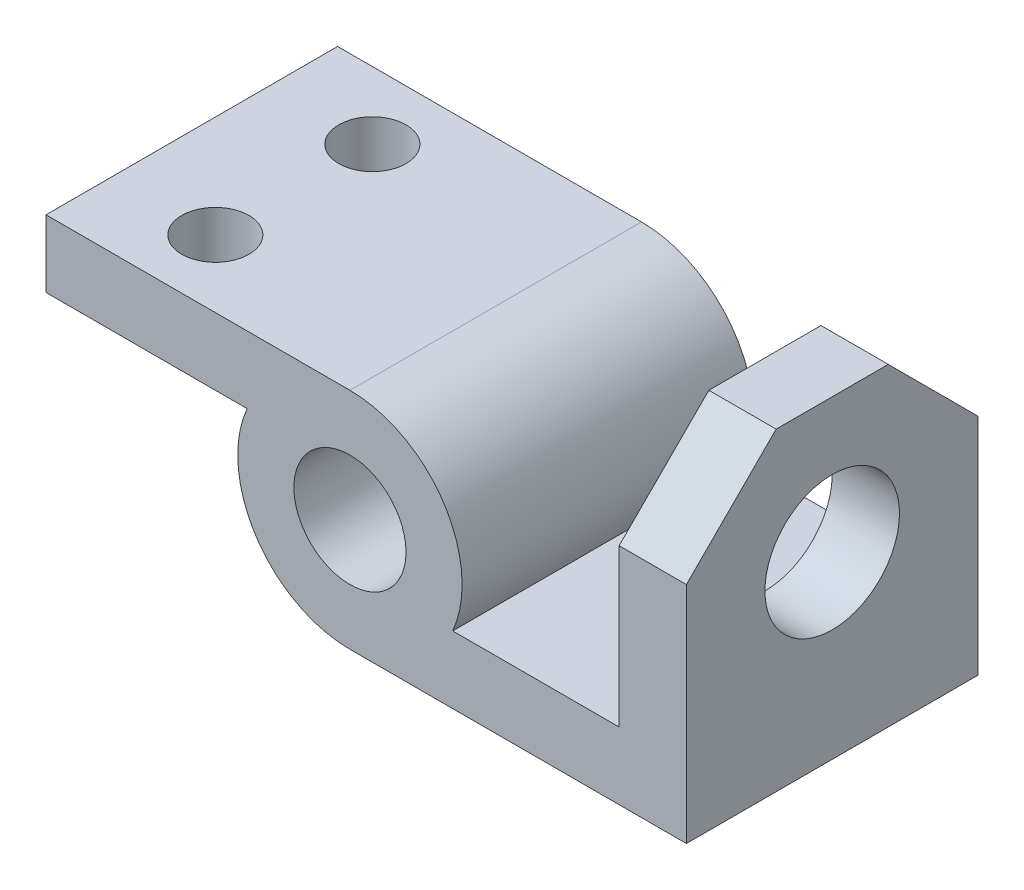
ISO-10303-21;
HEADER;
FILE_DESCRIPTION(('STEP AP214'),'2;1');
FILE_NAME('part.step','',(''),(''),'','','');
FILE_SCHEMA(('AUTOMOTIVE_DESIGN { 1 0 10303 214 1 1 1 1 }'));
ENDSEC;
DATA;
#1=APPLICATION_CONTEXT('core data for automotive mechanical design processes');
#2=APPLICATION_PROTOCOL_DEFINITION('international standard','automotive_design',2000,#1);
#3=PRODUCT_CONTEXT('',#1,'mechanical');
#4=PRODUCT('Part','Part','',(#3));
#5=PRODUCT_RELATED_PRODUCT_CATEGORY('part','',(#4));
#6=PRODUCT_DEFINITION_FORMATION('','',#4);
#7=PRODUCT_DEFINITION_CONTEXT('part definition',#1,'design');
#8=PRODUCT_DEFINITION('design','',#6,#7);
#9=PRODUCT_DEFINITION_SHAPE('','',#8);
#10=(LENGTH_UNIT() NAMED_UNIT(*) SI_UNIT(.MILLI.,.METRE.));
#11=(NAMED_UNIT(*) PLANE_ANGLE_UNIT() SI_UNIT($,.RADIAN.));
#12=(NAMED_UNIT(*) SI_UNIT($,.STERADIAN.) SOLID_ANGLE_UNIT());
#13=UNCERTAINTY_MEASURE_WITH_UNIT(LENGTH_MEASURE(1.E-05),#10,'distance_accuracy_value','');
#14=(GEOMETRIC_REPRESENTATION_CONTEXT(3) GLOBAL_UNCERTAINTY_ASSIGNED_CONTEXT((#13)) GLOBAL_UNIT_ASSIGNED_CONTEXT((#10,
#11,#12)) REPRESENTATION_CONTEXT('',''));
#15=CARTESIAN_POINT('',(0.,0.,0.));
#16=DIRECTION('',(0.,0.,1.));
#17=DIRECTION('',(1.,0.,0.));
#18=AXIS2_PLACEMENT_3D('',#15,#16,#17);
#19=CARTESIAN_POINT('',(0.,1.25,1.625));
#20=DIRECTION('',(0.,-1.,0.));
#21=DIRECTION('',(1.,0.,0.));
#22=AXIS2_PLACEMENT_3D('',#19,#20,#21);
#23=PLANE('',#22);
#24=CARTESIAN_POINT('',(-2.25,1.25,-0.875));
#25=DIRECTION('',(0.,1.,0.));
#26=DIRECTION('',(0.,0.,1.));
#27=AXIS2_PLACEMENT_3D('',#24,#25,#26);
#28=CIRCLE('',#27,0.374999999999998);
#29=CARTESIAN_POINT('',(-2.25,1.25,-0.500000000000002));
#30=VERTEX_POINT('',#29);
#31=EDGE_CURVE('E396',#30,#30,#28,.T.);
#32=ORIENTED_EDGE('',*,*,#31,.F.);
#33=EDGE_LOOP('',(#32));
#34=FACE_BOUND('',#33,.T.);
#35=DIRECTION('',(-1.,0.,0.));
#36=VECTOR('',#35,1.);
#37=CARTESIAN_POINT('',(0.,1.25,-1.625));
#38=LINE('',#37,#36);
#39=CARTESIAN_POINT('',(0.,1.25,-1.625));
#40=VERTEX_POINT('',#39);
#41=CARTESIAN_POINT('',(-3.3875,1.25,-1.625));
#42=VERTEX_POINT('',#41);
#43=EDGE_CURVE('E217',#40,#42,#38,.T.);
#44=ORIENTED_EDGE('',*,*,#43,.T.);
#45=DIRECTION('',(0.,0.,-1.));
#46=VECTOR('',#45,1.);
#47=CARTESIAN_POINT('',(-3.3875,1.25,1.625));
#48=LINE('',#47,#46);
#49=CARTESIAN_POINT('',(-3.3875,1.25,1.625));
#50=VERTEX_POINT('',#49);
#51=EDGE_CURVE('E133',#50,#42,#48,.T.);
#52=ORIENTED_EDGE('',*,*,#51,.F.);
#53=DIRECTION('',(-1.,0.,0.));
#54=VECTOR('',#53,1.);
#55=CARTESIAN_POINT('',(0.,1.25,1.625));
#56=LINE('',#55,#54);
#57=CARTESIAN_POINT('',(0.,1.25,1.625));
#58=VERTEX_POINT('',#57);
#59=EDGE_CURVE('E126',#58,#50,#56,.T.);
#60=ORIENTED_EDGE('',*,*,#59,.F.);
#61=DIRECTION('',(0.,0.,-1.));
#62=VECTOR('',#61,1.);
#63=CARTESIAN_POINT('',(0.,1.25,1.625));
#64=LINE('',#63,#62);
#65=EDGE_CURVE('E130',#58,#40,#64,.T.);
#66=ORIENTED_EDGE('',*,*,#65,.T.);
#67=EDGE_LOOP('',(#44,#52,#60,#66));
#68=FACE_BOUND('',#67,.T.);
#69=CARTESIAN_POINT('',(-2.25,1.25,0.875));
#70=DIRECTION('',(0.,1.,0.));
#71=DIRECTION('',(0.,0.,1.));
#72=AXIS2_PLACEMENT_3D('',#69,#70,#71);
#73=CIRCLE('',#72,0.374999999999998);
#74=CARTESIAN_POINT('',(-2.25,1.25,1.25));
#75=VERTEX_POINT('',#74);
#76=EDGE_CURVE('E402',#75,#75,#73,.T.);
#77=ORIENTED_EDGE('',*,*,#76,.F.);
#78=EDGE_LOOP('',(#77));
#79=FACE_BOUND('',#78,.T.);
#80=ADVANCED_FACE('F37',(#34,#68,#79),#23,.F.);
#81=CARTESIAN_POINT('',(3.75,-0.5,1.625));
#82=DIRECTION('',(0.,-1.,0.));
#83=DIRECTION('',(1.,0.,0.));
#84=AXIS2_PLACEMENT_3D('',#81,#82,#83);
#85=PLANE('',#84);
#86=DIRECTION('',(0.,0.,1.));
#87=VECTOR('',#86,1.);
#88=CARTESIAN_POINT('',(3.,-0.5,1.625));
#89=LINE('',#88,#87);
#90=CARTESIAN_POINT('',(3.,-0.5,-1.625));
#91=VERTEX_POINT('',#90);
#92=CARTESIAN_POINT('',(3.,-0.5,1.625));
#93=VERTEX_POINT('',#92);
#94=EDGE_CURVE('E203',#91,#93,#89,.T.);
#95=ORIENTED_EDGE('',*,*,#94,.F.);
#96=DIRECTION('',(-1.,0.,0.));
#97=VECTOR('',#96,1.);
#98=CARTESIAN_POINT('',(3.75,-0.5,-1.625));
#99=LINE('',#98,#97);
#100=CARTESIAN_POINT('',(1.14564392373896,-0.5,-1.625));
#101=VERTEX_POINT('',#100);
#102=EDGE_CURVE('E145',#91,#101,#99,.T.);
#103=ORIENTED_EDGE('',*,*,#102,.T.);
#104=DIRECTION('',(0.,0.,-1.));
#105=VECTOR('',#104,1.);
#106=CARTESIAN_POINT('',(1.14564392373896,-0.5,1.625));
#107=LINE('',#106,#105);
#108=CARTESIAN_POINT('',(1.14564392373896,-0.5,1.625));
#109=VERTEX_POINT('',#108);
#110=EDGE_CURVE('E215',#109,#101,#107,.T.);
#111=ORIENTED_EDGE('',*,*,#110,.F.);
#112=DIRECTION('',(-1.,0.,0.));
#113=VECTOR('',#112,1.);
#114=CARTESIAN_POINT('',(3.75,-0.5,1.625));
#115=LINE('',#114,#113);
#116=EDGE_CURVE('E141',#93,#109,#115,.T.);
#117=ORIENTED_EDGE('',*,*,#116,.F.);
#118=EDGE_LOOP('',(#95,#103,#111,#117));
#119=FACE_BOUND('',#118,.T.);
#120=ADVANCED_FACE('F266',(#119),#85,.F.);
#121=CARTESIAN_POINT('',(0.,0.,1.625));
#122=DIRECTION('',(0.,0.,-1.));
#123=DIRECTION('',(-1.,0.,0.));
#124=AXIS2_PLACEMENT_3D('',#121,#122,#123);
#125=CYLINDRICAL_SURFACE('',#124,1.25);
#126=CARTESIAN_POINT('',(0.,0.,-1.625));
#127=DIRECTION('',(0.,0.,1.));
#128=DIRECTION('',(1.,0.,0.));
#129=AXIS2_PLACEMENT_3D('',#126,#127,#128);
#130=CIRCLE('',#129,1.25);
#131=EDGE_CURVE('E149',#101,#40,#130,.T.);
#132=ORIENTED_EDGE('',*,*,#131,.T.);
#133=ORIENTED_EDGE('',*,*,#65,.F.);
#134=CARTESIAN_POINT('',(0.,0.,1.625));
#135=DIRECTION('',(0.,0.,1.));
#136=DIRECTION('',(1.,0.,0.));
#137=AXIS2_PLACEMENT_3D('',#134,#135,#136);
#138=CIRCLE('',#137,1.25);
#139=EDGE_CURVE('E136',#109,#58,#138,.T.);
#140=ORIENTED_EDGE('',*,*,#139,.F.);
#141=ORIENTED_EDGE('',*,*,#110,.T.);
#142=EDGE_LOOP('',(#132,#133,#140,#141));
#143=FACE_BOUND('',#142,.T.);
#144=ADVANCED_FACE('F147',(#143),#125,.T.);
#145=CARTESIAN_POINT('',(-3.3875,1.25,1.625));
#146=DIRECTION('',(1.,0.,0.));
#147=DIRECTION('',(0.,1.,0.));
#148=AXIS2_PLACEMENT_3D('',#145,#146,#147);
#149=PLANE('',#148);
#150=DIRECTION('',(0.,-1.,0.));
#151=VECTOR('',#150,1.);
#152=CARTESIAN_POINT('',(-3.3875,1.25,-1.625));
#153=LINE('',#152,#151);
#154=CARTESIAN_POINT('',(-3.3875,0.5,-1.625));
#155=VERTEX_POINT('',#154);
#156=EDGE_CURVE('E219',#42,#155,#153,.T.);
#157=ORIENTED_EDGE('',*,*,#156,.T.);
#158=DIRECTION('',(0.,0.,-1.));
#159=VECTOR('',#158,1.);
#160=CARTESIAN_POINT('',(-3.3875,0.5,1.625));
#161=LINE('',#160,#159);
#162=CARTESIAN_POINT('',(-3.3875,0.5,1.625));
#163=VERTEX_POINT('',#162);
#164=EDGE_CURVE('E155',#163,#155,#161,.T.);
#165=ORIENTED_EDGE('',*,*,#164,.F.);
#166=DIRECTION('',(0.,-1.,0.));
#167=VECTOR('',#166,1.);
#168=CARTESIAN_POINT('',(-3.3875,1.25,1.625));
#169=LINE('',#168,#167);
#170=EDGE_CURVE('E135',#50,#163,#169,.T.);
#171=ORIENTED_EDGE('',*,*,#170,.F.);
#172=ORIENTED_EDGE('',*,*,#51,.T.);
#173=EDGE_LOOP('',(#157,#165,#171,#172));
#174=FACE_BOUND('',#173,.T.);
#175=ADVANCED_FACE('F257',(#174),#149,.F.);
#176=CARTESIAN_POINT('',(-3.3875,0.5,1.625));
#177=DIRECTION('',(0.,1.,0.));
#178=DIRECTION('',(0.,0.,1.));
#179=AXIS2_PLACEMENT_3D('',#176,#177,#178);
#180=PLANE('',#179);
#181=CARTESIAN_POINT('',(-2.25,0.5,0.875));
#182=DIRECTION('',(0.,1.,0.));
#183=DIRECTION('',(0.,0.,1.));
#184=AXIS2_PLACEMENT_3D('',#181,#182,#183);
#185=CIRCLE('',#184,0.374999999999999);
#186=CARTESIAN_POINT('',(-2.25,0.5,1.25));
#187=VERTEX_POINT('',#186);
#188=EDGE_CURVE('E399',#187,#187,#185,.T.);
#189=ORIENTED_EDGE('',*,*,#188,.T.);
#190=EDGE_LOOP('',(#189));
#191=FACE_BOUND('',#190,.T.);
#192=CARTESIAN_POINT('',(-2.25,0.5,-0.875));
#193=DIRECTION('',(0.,1.,0.));
#194=DIRECTION('',(0.,0.,1.));
#195=AXIS2_PLACEMENT_3D('',#192,#193,#194);
#196=CIRCLE('',#195,0.374999999999999);
#197=CARTESIAN_POINT('',(-2.25,0.5,-0.500000000000001));
#198=VERTEX_POINT('',#197);
#199=EDGE_CURVE('E393',#198,#198,#196,.T.);
#200=ORIENTED_EDGE('',*,*,#199,.T.);
#201=EDGE_LOOP('',(#200));
#202=FACE_BOUND('',#201,.T.);
#203=DIRECTION('',(1.,0.,0.));
#204=VECTOR('',#203,1.);
#205=CARTESIAN_POINT('',(-3.3875,0.5,-1.625));
#206=LINE('',#205,#204);
#207=CARTESIAN_POINT('',(-1.14564392373896,0.499999999999999,-1.625));
#208=VERTEX_POINT('',#207);
#209=EDGE_CURVE('E221',#155,#208,#206,.T.);
#210=ORIENTED_EDGE('',*,*,#209,.T.);
#211=DIRECTION('',(0.,0.,-1.));
#212=VECTOR('',#211,1.);
#213=CARTESIAN_POINT('',(-1.14564392373896,0.499999999999999,1.625));
#214=LINE('',#213,#212);
#215=CARTESIAN_POINT('',(-1.14564392373896,0.499999999999999,1.625));
#216=VERTEX_POINT('',#215);
#217=EDGE_CURVE('E235',#216,#208,#214,.T.);
#218=ORIENTED_EDGE('',*,*,#217,.F.);
#219=DIRECTION('',(1.,0.,0.));
#220=VECTOR('',#219,1.);
#221=CARTESIAN_POINT('',(-3.3875,0.5,1.625));
#222=LINE('',#221,#220);
#223=EDGE_CURVE('E206',#163,#216,#222,.T.);
#224=ORIENTED_EDGE('',*,*,#223,.F.);
#225=ORIENTED_EDGE('',*,*,#164,.T.);
#226=EDGE_LOOP('',(#210,#218,#224,#225));
#227=FACE_BOUND('',#226,.T.);
#228=ADVANCED_FACE('F242',(#191,#202,#227),#180,.F.);
#229=CARTESIAN_POINT('',(0.,0.,1.625));
#230=DIRECTION('',(0.,0.,-1.));
#231=DIRECTION('',(-1.,0.,0.));
#232=AXIS2_PLACEMENT_3D('',#229,#230,#231);
#233=CYLINDRICAL_SURFACE('',#232,1.25);
#234=CARTESIAN_POINT('',(0.,0.,-1.625));
#235=DIRECTION('',(0.,0.,1.));
#236=DIRECTION('',(1.,0.,0.));
#237=AXIS2_PLACEMENT_3D('',#234,#235,#236);
#238=CIRCLE('',#237,1.25);
#239=CARTESIAN_POINT('',(0.,-1.25,-1.625));
#240=VERTEX_POINT('',#239);
#241=EDGE_CURVE('E223',#208,#240,#238,.T.);
#242=ORIENTED_EDGE('',*,*,#241,.T.);
#243=DIRECTION('',(0.,0.,-1.));
#244=VECTOR('',#243,1.);
#245=CARTESIAN_POINT('',(0.,-1.25,1.625));
#246=LINE('',#245,#244);
#247=CARTESIAN_POINT('',(0.,-1.25,1.625));
#248=VERTEX_POINT('',#247);
#249=EDGE_CURVE('E232',#248,#240,#246,.T.);
#250=ORIENTED_EDGE('',*,*,#249,.F.);
#251=CARTESIAN_POINT('',(0.,0.,1.625));
#252=DIRECTION('',(0.,0.,1.));
#253=DIRECTION('',(1.,0.,0.));
#254=AXIS2_PLACEMENT_3D('',#251,#252,#253);
#255=CIRCLE('',#254,1.25);
#256=EDGE_CURVE('E208',#216,#248,#255,.T.);
#257=ORIENTED_EDGE('',*,*,#256,.F.);
#258=ORIENTED_EDGE('',*,*,#217,.T.);
#259=EDGE_LOOP('',(#242,#250,#257,#258));
#260=FACE_BOUND('',#259,.T.);
#261=ADVANCED_FACE('F250',(#260),#233,.T.);
#262=CARTESIAN_POINT('',(0.,-1.25,1.625));
#263=DIRECTION('',(0.,1.,0.));
#264=DIRECTION('',(0.,0.,1.));
#265=AXIS2_PLACEMENT_3D('',#262,#263,#264);
#266=PLANE('',#265);
#267=DIRECTION('',(0.,0.,-1.));
#268=VECTOR('',#267,1.);
#269=CARTESIAN_POINT('',(3.75,-1.25,1.625));
#270=LINE('',#269,#268);
#271=CARTESIAN_POINT('',(3.75,-1.25,1.625));
#272=VERTEX_POINT('',#271);
#273=CARTESIAN_POINT('',(3.75,-1.25,-1.625));
#274=VERTEX_POINT('',#273);
#275=EDGE_CURVE('E230',#272,#274,#270,.T.);
#276=ORIENTED_EDGE('',*,*,#275,.F.);
#277=DIRECTION('',(1.,0.,0.));
#278=VECTOR('',#277,1.);
#279=CARTESIAN_POINT('',(0.,-1.25,1.625));
#280=LINE('',#279,#278);
#281=EDGE_CURVE('E210',#248,#272,#280,.T.);
#282=ORIENTED_EDGE('',*,*,#281,.F.);
#283=ORIENTED_EDGE('',*,*,#249,.T.);
#284=DIRECTION('',(1.,0.,0.));
#285=VECTOR('',#284,1.);
#286=CARTESIAN_POINT('',(0.,-1.25,-1.625));
#287=LINE('',#286,#285);
#288=EDGE_CURVE('E225',#240,#274,#287,.T.);
#289=ORIENTED_EDGE('',*,*,#288,.T.);
#290=EDGE_LOOP('',(#276,#282,#283,#289));
#291=FACE_BOUND('',#290,.T.);
#292=ADVANCED_FACE('F255',(#291),#266,.F.);
#293=CARTESIAN_POINT('',(3.75,-1.25,1.625));
#294=DIRECTION('',(-1.,0.,0.));
#295=DIRECTION('',(0.,0.,1.));
#296=AXIS2_PLACEMENT_3D('',#293,#294,#295);
#297=PLANE('',#296);
#298=CARTESIAN_POINT('',(3.75,0.75,0.));
#299=DIRECTION('',(1.,0.,0.));
#300=DIRECTION('',(0.,0.,-1.));
#301=AXIS2_PLACEMENT_3D('',#298,#299,#300);
#302=CIRCLE('',#301,0.749999999999998);
#303=CARTESIAN_POINT('',(3.75,0.75,-0.749999999999998));
#304=VERTEX_POINT('',#303);
#305=EDGE_CURVE('E388',#304,#304,#302,.T.);
#306=ORIENTED_EDGE('',*,*,#305,.F.);
#307=EDGE_LOOP('',(#306));
#308=FACE_BOUND('',#307,.T.);
#309=DIRECTION('',(0.,1.,0.));
#310=VECTOR('',#309,1.);
#311=CARTESIAN_POINT('',(3.75,-1.25,-1.625));
#312=LINE('',#311,#310);
#313=CARTESIAN_POINT('',(3.75,1.25,-1.625));
#314=VERTEX_POINT('',#313);
#315=EDGE_CURVE('E190',#274,#314,#312,.T.);
#316=ORIENTED_EDGE('',*,*,#315,.T.);
#317=DIRECTION('',(0.,0.707106781186546,0.707106781186549));
#318=VECTOR('',#317,1.);
#319=CARTESIAN_POINT('',(3.75,1.25,-1.625));
#320=LINE('',#319,#318);
#321=CARTESIAN_POINT('',(3.75,2.25,-0.624999999999996));
#322=VERTEX_POINT('',#321);
#323=EDGE_CURVE('E160',#314,#322,#320,.T.);
#324=ORIENTED_EDGE('',*,*,#323,.T.);
#325=DIRECTION('',(0.,0.,1.));
#326=VECTOR('',#325,1.);
#327=CARTESIAN_POINT('',(3.75,2.25,-1.625));
#328=LINE('',#327,#326);
#329=CARTESIAN_POINT('',(3.75,2.25,0.624999999999999));
#330=VERTEX_POINT('',#329);
#331=EDGE_CURVE('E182',#322,#330,#328,.T.);
#332=ORIENTED_EDGE('',*,*,#331,.T.);
#333=DIRECTION('',(0.,0.707106781186549,-0.707106781186546));
#334=VECTOR('',#333,1.);
#335=CARTESIAN_POINT('',(3.75,2.25,0.625));
#336=LINE('',#335,#334);
#337=CARTESIAN_POINT('',(3.75,1.25,1.625));
#338=VERTEX_POINT('',#337);
#339=EDGE_CURVE('E153',#330,#338,#336,.F.);
#340=ORIENTED_EDGE('',*,*,#339,.T.);
#341=DIRECTION('',(0.,1.,0.));
#342=VECTOR('',#341,1.);
#343=CARTESIAN_POINT('',(3.75,-1.25,1.625));
#344=LINE('',#343,#342);
#345=EDGE_CURVE('E212',#272,#338,#344,.T.);
#346=ORIENTED_EDGE('',*,*,#345,.F.);
#347=ORIENTED_EDGE('',*,*,#275,.T.);
#348=EDGE_LOOP('',(#316,#324,#332,#340,#346,#347));
#349=FACE_BOUND('',#348,.T.);
#350=ADVANCED_FACE('F188',(#308,#349),#297,.F.);
#351=CARTESIAN_POINT('',(0.,0.,1.625));
#352=DIRECTION('',(0.,0.,1.));
#353=DIRECTION('',(1.,0.,0.));
#354=AXIS2_PLACEMENT_3D('',#351,#352,#353);
#355=PLANE('',#354);
#356=CARTESIAN_POINT('',(0.,0.,1.625));
#357=DIRECTION('',(0.,0.,1.));
#358=DIRECTION('',(1.,0.,0.));
#359=AXIS2_PLACEMENT_3D('',#356,#357,#358);
#360=CIRCLE('',#359,0.624999999999998);
#361=CARTESIAN_POINT('',(0.624999999999998,0.,1.625));
#362=VERTEX_POINT('',#361);
#363=EDGE_CURVE('E197',#362,#362,#360,.T.);
#364=ORIENTED_EDGE('',*,*,#363,.F.);
#365=EDGE_LOOP('',(#364));
#366=FACE_BOUND('',#365,.T.);
#367=ORIENTED_EDGE('',*,*,#345,.T.);
#368=DIRECTION('',(-1.,0.,0.));
#369=VECTOR('',#368,1.);
#370=CARTESIAN_POINT('',(0.,1.25,1.625));
#371=LINE('',#370,#369);
#372=CARTESIAN_POINT('',(3.,1.25,1.625));
#373=VERTEX_POINT('',#372);
#374=EDGE_CURVE('E11',#338,#373,#371,.T.);
#375=ORIENTED_EDGE('',*,*,#374,.T.);
#376=DIRECTION('',(0.,-1.,0.));
#377=VECTOR('',#376,1.);
#378=CARTESIAN_POINT('',(3.,-1.25,1.625));
#379=LINE('',#378,#377);
#380=EDGE_CURVE('E201',#373,#93,#379,.T.);
#381=ORIENTED_EDGE('',*,*,#380,.T.);
#382=ORIENTED_EDGE('',*,*,#116,.T.);
#383=ORIENTED_EDGE('',*,*,#139,.T.);
#384=ORIENTED_EDGE('',*,*,#59,.T.);
#385=ORIENTED_EDGE('',*,*,#170,.T.);
#386=ORIENTED_EDGE('',*,*,#223,.T.);
#387=ORIENTED_EDGE('',*,*,#256,.T.);
#388=ORIENTED_EDGE('',*,*,#281,.T.);
#389=EDGE_LOOP('',(#367,#375,#381,#382,#383,#384,#385,#386,#387,#388));
#390=FACE_BOUND('',#389,.T.);
#391=ADVANCED_FACE('F139',(#366,#390),#355,.T.);
#392=CARTESIAN_POINT('',(0.,0.,-1.625));
#393=DIRECTION('',(0.,0.,1.));
#394=DIRECTION('',(1.,0.,0.));
#395=AXIS2_PLACEMENT_3D('',#392,#393,#394);
#396=PLANE('',#395);
#397=CARTESIAN_POINT('',(0.,0.,-1.625));
#398=DIRECTION('',(0.,0.,1.));
#399=DIRECTION('',(1.,0.,0.));
#400=AXIS2_PLACEMENT_3D('',#397,#398,#399);
#401=CIRCLE('',#400,0.624999999999999);
#402=CARTESIAN_POINT('',(0.624999999999999,0.,-1.625));
#403=VERTEX_POINT('',#402);
#404=EDGE_CURVE('E194',#403,#403,#401,.T.);
#405=ORIENTED_EDGE('',*,*,#404,.T.);
#406=EDGE_LOOP('',(#405));
#407=FACE_BOUND('',#406,.T.);
#408=DIRECTION('',(0.,1.,0.));
#409=VECTOR('',#408,1.);
#410=CARTESIAN_POINT('',(3.,-1.25,-1.625));
#411=LINE('',#410,#409);
#412=CARTESIAN_POINT('',(3.,1.25,-1.625));
#413=VERTEX_POINT('',#412);
#414=EDGE_CURVE('E172',#91,#413,#411,.T.);
#415=ORIENTED_EDGE('',*,*,#414,.T.);
#416=DIRECTION('',(1.,0.,0.));
#417=VECTOR('',#416,1.);
#418=CARTESIAN_POINT('',(3.75,1.25,-1.625));
#419=LINE('',#418,#417);
#420=EDGE_CURVE('E150',#413,#314,#419,.T.);
#421=ORIENTED_EDGE('',*,*,#420,.T.);
#422=ORIENTED_EDGE('',*,*,#315,.F.);
#423=ORIENTED_EDGE('',*,*,#288,.F.);
#424=ORIENTED_EDGE('',*,*,#241,.F.);
#425=ORIENTED_EDGE('',*,*,#209,.F.);
#426=ORIENTED_EDGE('',*,*,#156,.F.);
#427=ORIENTED_EDGE('',*,*,#43,.F.);
#428=ORIENTED_EDGE('',*,*,#131,.F.);
#429=ORIENTED_EDGE('',*,*,#102,.F.);
#430=EDGE_LOOP('',(#415,#421,#422,#423,#424,#425,#426,#427,#428,#429));
#431=FACE_BOUND('',#430,.T.);
#432=ADVANCED_FACE('F179',(#407,#431),#396,.F.);
#433=CARTESIAN_POINT('',(3.,0.,0.));
#434=DIRECTION('',(1.,0.,0.));
#435=DIRECTION('',(0.,0.,-1.));
#436=AXIS2_PLACEMENT_3D('',#433,#434,#435);
#437=PLANE('',#436);
#438=CARTESIAN_POINT('',(3.,0.75,0.));
#439=DIRECTION('',(1.,0.,0.));
#440=DIRECTION('',(0.,0.,-1.));
#441=AXIS2_PLACEMENT_3D('',#438,#439,#440);
#442=CIRCLE('',#441,0.749999999999999);
#443=CARTESIAN_POINT('',(3.,0.75,-0.749999999999999));
#444=VERTEX_POINT('',#443);
#445=EDGE_CURVE('E385',#444,#444,#442,.T.);
#446=ORIENTED_EDGE('',*,*,#445,.T.);
#447=EDGE_LOOP('',(#446));
#448=FACE_BOUND('',#447,.T.);
#449=DIRECTION('',(0.,0.,1.));
#450=VECTOR('',#449,1.);
#451=CARTESIAN_POINT('',(3.,2.25,-1.625));
#452=LINE('',#451,#450);
#453=CARTESIAN_POINT('',(3.,2.25,-0.624999999999996));
#454=VERTEX_POINT('',#453);
#455=CARTESIAN_POINT('',(3.,2.25,0.624999999999999));
#456=VERTEX_POINT('',#455);
#457=EDGE_CURVE('E173',#454,#456,#452,.T.);
#458=ORIENTED_EDGE('',*,*,#457,.F.);
#459=DIRECTION('',(0.,-0.707106781186546,-0.707106781186549));
#460=VECTOR('',#459,1.);
#461=CARTESIAN_POINT('',(3.,1.25,-1.625));
#462=LINE('',#461,#460);
#463=EDGE_CURVE('E45',#454,#413,#462,.T.);
#464=ORIENTED_EDGE('',*,*,#463,.T.);
#465=ORIENTED_EDGE('',*,*,#414,.F.);
#466=ORIENTED_EDGE('',*,*,#94,.T.);
#467=ORIENTED_EDGE('',*,*,#380,.F.);
#468=DIRECTION('',(0.,-0.707106781186549,0.707106781186546));
#469=VECTOR('',#468,1.);
#470=CARTESIAN_POINT('',(3.,2.25,0.625));
#471=LINE('',#470,#469);
#472=EDGE_CURVE('E57',#373,#456,#471,.F.);
#473=ORIENTED_EDGE('',*,*,#472,.T.);
#474=EDGE_LOOP('',(#458,#464,#465,#466,#467,#473));
#475=FACE_BOUND('',#474,.T.);
#476=ADVANCED_FACE('F170',(#448,#475),#437,.F.);
#477=CARTESIAN_POINT('',(3.,2.25,-1.625));
#478=DIRECTION('',(0.,1.,0.));
#479=DIRECTION('',(0.,0.,1.));
#480=AXIS2_PLACEMENT_3D('',#477,#478,#479);
#481=PLANE('',#480);
#482=ORIENTED_EDGE('',*,*,#331,.F.);
#483=DIRECTION('',(-1.,0.,0.));
#484=VECTOR('',#483,1.);
#485=CARTESIAN_POINT('',(3.,2.25,-0.624999999999996));
#486=LINE('',#485,#484);
#487=EDGE_CURVE('E165',#322,#454,#486,.T.);
#488=ORIENTED_EDGE('',*,*,#487,.T.);
#489=ORIENTED_EDGE('',*,*,#457,.T.);
#490=DIRECTION('',(1.,0.,0.));
#491=VECTOR('',#490,1.);
#492=CARTESIAN_POINT('',(3.,2.25,0.625));
#493=LINE('',#492,#491);
#494=EDGE_CURVE('E162',#456,#330,#493,.T.);
#495=ORIENTED_EDGE('',*,*,#494,.T.);
#496=EDGE_LOOP('',(#482,#488,#489,#495));
#497=FACE_BOUND('',#496,.T.);
#498=ADVANCED_FACE('F192',(#497),#481,.T.);
#499=CARTESIAN_POINT('',(0.,1.25,-1.625));
#500=DIRECTION('',(0.,0.707106781186549,-0.707106781186546));
#501=DIRECTION('',(-1.,0.,0.));
#502=AXIS2_PLACEMENT_3D('',#499,#500,#501);
#503=PLANE('',#502);
#504=ORIENTED_EDGE('',*,*,#463,.F.);
#505=ORIENTED_EDGE('',*,*,#487,.F.);
#506=ORIENTED_EDGE('',*,*,#323,.F.);
#507=ORIENTED_EDGE('',*,*,#420,.F.);
#508=EDGE_LOOP('',(#504,#505,#506,#507));
#509=FACE_BOUND('',#508,.T.);
#510=ADVANCED_FACE('F184',(#509),#503,.T.);
#511=CARTESIAN_POINT('',(3.,2.25,0.625));
#512=DIRECTION('',(0.,-0.707106781186546,-0.707106781186549));
#513=DIRECTION('',(1.,0.,0.));
#514=AXIS2_PLACEMENT_3D('',#511,#512,#513);
#515=PLANE('',#514);
#516=ORIENTED_EDGE('',*,*,#472,.F.);
#517=ORIENTED_EDGE('',*,*,#374,.F.);
#518=ORIENTED_EDGE('',*,*,#339,.F.);
#519=ORIENTED_EDGE('',*,*,#494,.F.);
#520=EDGE_LOOP('',(#516,#517,#518,#519));
#521=FACE_BOUND('',#520,.T.);
#522=ADVANCED_FACE('F39',(#521),#515,.F.);
#523=CARTESIAN_POINT('',(0.,0.,1.625));
#524=DIRECTION('',(0.,0.,1.));
#525=DIRECTION('',(1.,0.,0.));
#526=AXIS2_PLACEMENT_3D('',#523,#524,#525);
#527=CYLINDRICAL_SURFACE('',#526,0.624999999999999);
#528=ORIENTED_EDGE('',*,*,#404,.F.);
#529=EDGE_LOOP('',(#528));
#530=FACE_BOUND('',#529,.T.);
#531=ORIENTED_EDGE('',*,*,#363,.T.);
#532=EDGE_LOOP('',(#531));
#533=FACE_BOUND('',#532,.T.);
#534=ADVANCED_FACE('F282',(#530,#533),#527,.F.);
#535=CARTESIAN_POINT('',(3.75,0.75,0.));
#536=DIRECTION('',(1.,0.,0.));
#537=DIRECTION('',(0.,0.,-1.));
#538=AXIS2_PLACEMENT_3D('',#535,#536,#537);
#539=CYLINDRICAL_SURFACE('',#538,0.749999999999999);
#540=ORIENTED_EDGE('',*,*,#445,.F.);
#541=EDGE_LOOP('',(#540));
#542=FACE_BOUND('',#541,.T.);
#543=ORIENTED_EDGE('',*,*,#305,.T.);
#544=EDGE_LOOP('',(#543));
#545=FACE_BOUND('',#544,.T.);
#546=ADVANCED_FACE('F337',(#542,#545),#539,.F.);
#547=CARTESIAN_POINT('',(-2.25,1.25,-0.875));
#548=DIRECTION('',(0.,1.,0.));
#549=DIRECTION('',(0.,0.,1.));
#550=AXIS2_PLACEMENT_3D('',#547,#548,#549);
#551=CYLINDRICAL_SURFACE('',#550,0.374999999999999);
#552=ORIENTED_EDGE('',*,*,#199,.F.);
#553=EDGE_LOOP('',(#552));
#554=FACE_BOUND('',#553,.T.);
#555=ORIENTED_EDGE('',*,*,#31,.T.);
#556=EDGE_LOOP('',(#555));
#557=FACE_BOUND('',#556,.T.);
#558=ADVANCED_FACE('F342',(#554,#557),#551,.F.);
#559=CARTESIAN_POINT('',(-2.25,1.25,0.875));
#560=DIRECTION('',(0.,1.,0.));
#561=DIRECTION('',(0.,0.,1.));
#562=AXIS2_PLACEMENT_3D('',#559,#560,#561);
#563=CYLINDRICAL_SURFACE('',#562,0.374999999999999);
#564=ORIENTED_EDGE('',*,*,#188,.F.);
#565=EDGE_LOOP('',(#564));
#566=FACE_BOUND('',#565,.T.);
#567=ORIENTED_EDGE('',*,*,#76,.T.);
#568=EDGE_LOOP('',(#567));
#569=FACE_BOUND('',#568,.T.);
#570=ADVANCED_FACE('F353',(#566,#569),#563,.F.);
#571=CLOSED_SHELL('',(#80,#120,#144,#175,#228,#261,#292,#350,#391,#432,#476,#498,#510,#522,#534,
#546,#558,#570));
#572=MANIFOLD_SOLID_BREP('B2',#571);
#573=ADVANCED_BREP_SHAPE_REPRESENTATION('',(#18,#572),#14);
#574=SHAPE_DEFINITION_REPRESENTATION(#9,#573);
ENDSEC;
END-ISO-10303-21;
